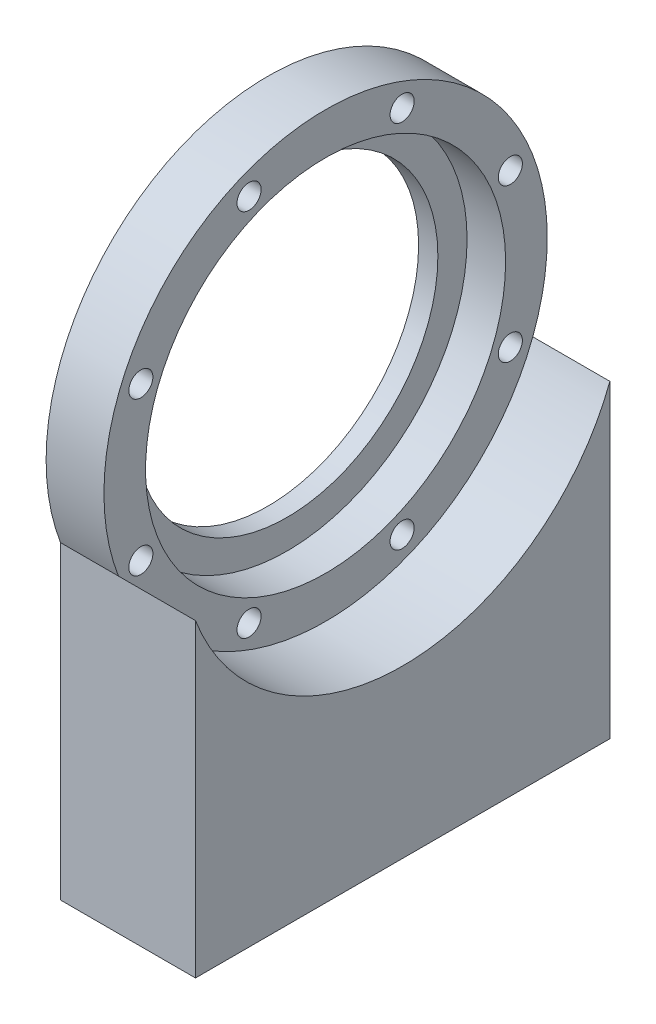
ISO-10303-21;
HEADER;
FILE_DESCRIPTION(('STEP AP214'),'2;1');
FILE_NAME('part.step','',(''),(''),'','','');
FILE_SCHEMA(('AUTOMOTIVE_DESIGN { 1 0 10303 214 1 1 1 1 }'));
ENDSEC;
DATA;
#1=APPLICATION_CONTEXT('core data for automotive mechanical design processes');
#2=APPLICATION_PROTOCOL_DEFINITION('international standard','automotive_design',2000,#1);
#3=PRODUCT_CONTEXT('',#1,'mechanical');
#4=PRODUCT('Part','Part','',(#3));
#5=PRODUCT_RELATED_PRODUCT_CATEGORY('part','',(#4));
#6=PRODUCT_DEFINITION_FORMATION('','',#4);
#7=PRODUCT_DEFINITION_CONTEXT('part definition',#1,'design');
#8=PRODUCT_DEFINITION('design','',#6,#7);
#9=PRODUCT_DEFINITION_SHAPE('','',#8);
#10=(LENGTH_UNIT() NAMED_UNIT(*) SI_UNIT(.MILLI.,.METRE.));
#11=(NAMED_UNIT(*) PLANE_ANGLE_UNIT() SI_UNIT($,.RADIAN.));
#12=(NAMED_UNIT(*) SI_UNIT($,.STERADIAN.) SOLID_ANGLE_UNIT());
#13=UNCERTAINTY_MEASURE_WITH_UNIT(LENGTH_MEASURE(1.E-05),#10,'distance_accuracy_value','');
#14=(GEOMETRIC_REPRESENTATION_CONTEXT(3) GLOBAL_UNCERTAINTY_ASSIGNED_CONTEXT((#13)) GLOBAL_UNIT_ASSIGNED_CONTEXT((#10,
#11,#12)) REPRESENTATION_CONTEXT('',''));
#15=CARTESIAN_POINT('',(0.,0.,0.));
#16=DIRECTION('',(0.,0.,1.));
#17=DIRECTION('',(1.,0.,0.));
#18=AXIS2_PLACEMENT_3D('',#15,#16,#17);
#19=CARTESIAN_POINT('',(2.,0.,0.));
#20=DIRECTION('',(-1.,0.,0.));
#21=DIRECTION('',(0.,0.,1.));
#22=AXIS2_PLACEMENT_3D('',#19,#20,#21);
#23=CYLINDRICAL_SURFACE('',#22,15.6521739130435);
#24=CARTESIAN_POINT('',(2.,0.,0.));
#25=DIRECTION('',(1.,0.,0.));
#26=DIRECTION('',(0.,0.,-1.));
#27=AXIS2_PLACEMENT_3D('',#24,#25,#26);
#28=CIRCLE('',#27,15.6521739130435);
#29=CARTESIAN_POINT('',(2.,0.,-15.6521739130435));
#30=VERTEX_POINT('',#29);
#31=EDGE_CURVE('E11',#30,#30,#28,.T.);
#32=ORIENTED_EDGE('',*,*,#31,.T.);
#33=EDGE_LOOP('',(#32));
#34=FACE_BOUND('',#33,.T.);
#35=CARTESIAN_POINT('',(0.,0.,0.));
#36=DIRECTION('',(1.,0.,0.));
#37=DIRECTION('',(0.,0.,-1.));
#38=AXIS2_PLACEMENT_3D('',#35,#36,#37);
#39=CIRCLE('',#38,15.6521739130435);
#40=CARTESIAN_POINT('',(0.,0.,-15.6521739130435));
#41=VERTEX_POINT('',#40);
#42=EDGE_CURVE('E49',#41,#41,#39,.T.);
#43=ORIENTED_EDGE('',*,*,#42,.F.);
#44=EDGE_LOOP('',(#43));
#45=FACE_BOUND('',#44,.T.);
#46=ADVANCED_FACE('F46',(#34,#45),#23,.F.);
#47=CARTESIAN_POINT('',(2.,0.,0.));
#48=DIRECTION('',(1.,0.,0.));
#49=DIRECTION('',(0.,0.,-1.));
#50=AXIS2_PLACEMENT_3D('',#47,#48,#49);
#51=PLANE('',#50);
#52=ORIENTED_EDGE('',*,*,#31,.F.);
#53=EDGE_LOOP('',(#52));
#54=FACE_BOUND('',#53,.T.);
#55=CARTESIAN_POINT('',(2.,0.,0.));
#56=DIRECTION('',(1.,0.,0.));
#57=DIRECTION('',(0.,0.,-1.));
#58=AXIS2_PLACEMENT_3D('',#55,#56,#57);
#59=CIRCLE('',#58,18.68);
#60=CARTESIAN_POINT('',(2.,0.,-18.68));
#61=VERTEX_POINT('',#60);
#62=EDGE_CURVE('E164',#61,#61,#59,.F.);
#63=ORIENTED_EDGE('',*,*,#62,.F.);
#64=EDGE_LOOP('',(#63));
#65=FACE_BOUND('',#64,.T.);
#66=ADVANCED_FACE('F200',(#54,#65),#51,.T.);
#67=CARTESIAN_POINT('',(0.,0.,0.));
#68=DIRECTION('',(1.,0.,0.));
#69=DIRECTION('',(0.,0.,-1.));
#70=AXIS2_PLACEMENT_3D('',#67,#68,#69);
#71=PLANE('',#70);
#72=ORIENTED_EDGE('',*,*,#42,.T.);
#73=EDGE_LOOP('',(#72));
#74=FACE_BOUND('',#73,.T.);
#75=CARTESIAN_POINT('',(0.,19.1705002996092,7.9406812215757));
#76=DIRECTION('',(1.,0.,0.));
#77=DIRECTION('',(0.,0.,-1.));
#78=AXIS2_PLACEMENT_3D('',#75,#76,#77);
#79=CIRCLE('',#78,1.25);
#80=CARTESIAN_POINT('',(0.,19.1705002996092,6.6906812215757));
#81=VERTEX_POINT('',#80);
#82=EDGE_CURVE('E129',#81,#81,#79,.T.);
#83=ORIENTED_EDGE('',*,*,#82,.T.);
#84=EDGE_LOOP('',(#83));
#85=FACE_BOUND('',#84,.T.);
#86=CARTESIAN_POINT('',(0.,7.94068122157552,19.1705002996092));
#87=DIRECTION('',(1.,0.,0.));
#88=DIRECTION('',(0.,0.,-1.));
#89=AXIS2_PLACEMENT_3D('',#86,#87,#88);
#90=CIRCLE('',#89,1.25);
#91=CARTESIAN_POINT('',(0.,7.94068122157552,17.9205002996092));
#92=VERTEX_POINT('',#91);
#93=EDGE_CURVE('E167',#92,#92,#90,.T.);
#94=ORIENTED_EDGE('',*,*,#93,.T.);
#95=EDGE_LOOP('',(#94));
#96=FACE_BOUND('',#95,.T.);
#97=CARTESIAN_POINT('',(0.,-7.94068122157571,19.1705002996092));
#98=DIRECTION('',(1.,0.,0.));
#99=DIRECTION('',(0.,0.,-1.));
#100=AXIS2_PLACEMENT_3D('',#97,#98,#99);
#101=CIRCLE('',#100,1.25);
#102=CARTESIAN_POINT('',(0.,-7.94068122157571,17.9205002996092));
#103=VERTEX_POINT('',#102);
#104=EDGE_CURVE('E170',#103,#103,#101,.T.);
#105=ORIENTED_EDGE('',*,*,#104,.T.);
#106=EDGE_LOOP('',(#105));
#107=FACE_BOUND('',#106,.T.);
#108=CARTESIAN_POINT('',(0.,-19.1705002996092,7.94068122157552));
#109=DIRECTION('',(1.,0.,0.));
#110=DIRECTION('',(0.,0.,-1.));
#111=AXIS2_PLACEMENT_3D('',#108,#109,#110);
#112=CIRCLE('',#111,1.25);
#113=CARTESIAN_POINT('',(0.,-19.1705002996092,6.69068122157552));
#114=VERTEX_POINT('',#113);
#115=EDGE_CURVE('E173',#114,#114,#112,.T.);
#116=ORIENTED_EDGE('',*,*,#115,.T.);
#117=EDGE_LOOP('',(#116));
#118=FACE_BOUND('',#117,.T.);
#119=CARTESIAN_POINT('',(0.,-19.1705002996092,-7.94068122157571));
#120=DIRECTION('',(1.,0.,0.));
#121=DIRECTION('',(0.,0.,-1.));
#122=AXIS2_PLACEMENT_3D('',#119,#120,#121);
#123=CIRCLE('',#122,1.25);
#124=CARTESIAN_POINT('',(0.,-19.1705002996092,-9.1906812215757));
#125=VERTEX_POINT('',#124);
#126=EDGE_CURVE('E176',#125,#125,#123,.T.);
#127=ORIENTED_EDGE('',*,*,#126,.T.);
#128=EDGE_LOOP('',(#127));
#129=FACE_BOUND('',#128,.T.);
#130=CARTESIAN_POINT('',(0.,-7.94068122157552,-19.1705002996092));
#131=DIRECTION('',(1.,0.,0.));
#132=DIRECTION('',(0.,0.,-1.));
#133=AXIS2_PLACEMENT_3D('',#130,#131,#132);
#134=CIRCLE('',#133,1.25);
#135=CARTESIAN_POINT('',(0.,-7.94068122157552,-20.4205002996092));
#136=VERTEX_POINT('',#135);
#137=EDGE_CURVE('E179',#136,#136,#134,.T.);
#138=ORIENTED_EDGE('',*,*,#137,.T.);
#139=EDGE_LOOP('',(#138));
#140=FACE_BOUND('',#139,.T.);
#141=CARTESIAN_POINT('',(0.,7.94068122157571,-19.1705002996092));
#142=DIRECTION('',(1.,0.,0.));
#143=DIRECTION('',(0.,0.,-1.));
#144=AXIS2_PLACEMENT_3D('',#141,#142,#143);
#145=CIRCLE('',#144,1.25);
#146=CARTESIAN_POINT('',(0.,7.94068122157571,-20.4205002996092));
#147=VERTEX_POINT('',#146);
#148=EDGE_CURVE('E182',#147,#147,#145,.T.);
#149=ORIENTED_EDGE('',*,*,#148,.T.);
#150=EDGE_LOOP('',(#149));
#151=FACE_BOUND('',#150,.T.);
#152=CARTESIAN_POINT('',(0.,19.1705002996092,-7.94068122157552));
#153=DIRECTION('',(1.,0.,0.));
#154=DIRECTION('',(0.,0.,-1.));
#155=AXIS2_PLACEMENT_3D('',#152,#153,#154);
#156=CIRCLE('',#155,1.25);
#157=CARTESIAN_POINT('',(0.,19.1705002996092,-9.19068122157552));
#158=VERTEX_POINT('',#157);
#159=EDGE_CURVE('E185',#158,#158,#156,.T.);
#160=ORIENTED_EDGE('',*,*,#159,.T.);
#161=EDGE_LOOP('',(#160));
#162=FACE_BOUND('',#161,.T.);
#163=CARTESIAN_POINT('',(0.,0.,0.));
#164=DIRECTION('',(1.,0.,0.));
#165=DIRECTION('',(0.,0.,-1.));
#166=AXIS2_PLACEMENT_3D('',#163,#164,#165);
#167=CIRCLE('',#166,23.);
#168=CARTESIAN_POINT('',(0.,-8.1700673191841,-21.5));
#169=VERTEX_POINT('',#168);
#170=CARTESIAN_POINT('',(0.,-8.1700673191841,21.5));
#171=VERTEX_POINT('',#170);
#172=EDGE_CURVE('E138',#169,#171,#167,.T.);
#173=ORIENTED_EDGE('',*,*,#172,.F.);
#174=DIRECTION('',(0.,-1.,0.));
#175=VECTOR('',#174,1.);
#176=CARTESIAN_POINT('',(0.,-40.29,-21.5));
#177=LINE('',#176,#175);
#178=CARTESIAN_POINT('',(0.,-40.29,-21.5));
#179=VERTEX_POINT('',#178);
#180=EDGE_CURVE('E122',#169,#179,#177,.T.);
#181=ORIENTED_EDGE('',*,*,#180,.T.);
#182=DIRECTION('',(0.,0.,1.));
#183=VECTOR('',#182,1.);
#184=CARTESIAN_POINT('',(0.,-40.29,-21.5));
#185=LINE('',#184,#183);
#186=CARTESIAN_POINT('',(0.,-40.29,21.5));
#187=VERTEX_POINT('',#186);
#188=EDGE_CURVE('E113',#179,#187,#185,.T.);
#189=ORIENTED_EDGE('',*,*,#188,.T.);
#190=DIRECTION('',(0.,1.,0.));
#191=VECTOR('',#190,1.);
#192=CARTESIAN_POINT('',(0.,-40.29,21.5));
#193=LINE('',#192,#191);
#194=EDGE_CURVE('E110',#187,#171,#193,.T.);
#195=ORIENTED_EDGE('',*,*,#194,.T.);
#196=EDGE_LOOP('',(#173,#181,#189,#195));
#197=FACE_BOUND('',#196,.T.);
#198=ADVANCED_FACE('F196',(#74,#85,#96,#107,#118,#129,#140,#151,#162,#197),#71,.F.);
#199=CARTESIAN_POINT('',(6.,0.,0.));
#200=DIRECTION('',(-1.,0.,0.));
#201=DIRECTION('',(0.,0.,1.));
#202=AXIS2_PLACEMENT_3D('',#199,#200,#201);
#203=CYLINDRICAL_SURFACE('',#202,18.68);
#204=ORIENTED_EDGE('',*,*,#62,.T.);
#205=EDGE_LOOP('',(#204));
#206=FACE_BOUND('',#205,.T.);
#207=CARTESIAN_POINT('',(6.,0.,0.));
#208=DIRECTION('',(1.,0.,0.));
#209=DIRECTION('',(0.,0.,-1.));
#210=AXIS2_PLACEMENT_3D('',#207,#208,#209);
#211=CIRCLE('',#210,18.68);
#212=CARTESIAN_POINT('',(6.,0.,-18.68));
#213=VERTEX_POINT('',#212);
#214=EDGE_CURVE('E159',#213,#213,#211,.T.);
#215=ORIENTED_EDGE('',*,*,#214,.T.);
#216=EDGE_LOOP('',(#215));
#217=FACE_BOUND('',#216,.T.);
#218=ADVANCED_FACE('F212',(#206,#217),#203,.F.);
#219=CARTESIAN_POINT('',(6.,19.1705002996092,-7.94068122157552));
#220=DIRECTION('',(-1.,0.,0.));
#221=DIRECTION('',(0.,0.,1.));
#222=AXIS2_PLACEMENT_3D('',#219,#220,#221);
#223=CYLINDRICAL_SURFACE('',#222,1.25);
#224=CARTESIAN_POINT('',(6.,19.1705002996092,-7.94068122157552));
#225=DIRECTION('',(1.,0.,0.));
#226=DIRECTION('',(0.,0.,-1.));
#227=AXIS2_PLACEMENT_3D('',#224,#225,#226);
#228=CIRCLE('',#227,1.25);
#229=CARTESIAN_POINT('',(6.,19.1705002996092,-9.19068122157552));
#230=VERTEX_POINT('',#229);
#231=EDGE_CURVE('E156',#230,#230,#228,.T.);
#232=ORIENTED_EDGE('',*,*,#231,.T.);
#233=EDGE_LOOP('',(#232));
#234=FACE_BOUND('',#233,.T.);
#235=ORIENTED_EDGE('',*,*,#159,.F.);
#236=EDGE_LOOP('',(#235));
#237=FACE_BOUND('',#236,.T.);
#238=ADVANCED_FACE('F242',(#234,#237),#223,.F.);
#239=CARTESIAN_POINT('',(6.,7.94068122157571,-19.1705002996092));
#240=DIRECTION('',(-1.,0.,0.));
#241=DIRECTION('',(0.,0.,1.));
#242=AXIS2_PLACEMENT_3D('',#239,#240,#241);
#243=CYLINDRICAL_SURFACE('',#242,1.25);
#244=CARTESIAN_POINT('',(6.,7.94068122157571,-19.1705002996092));
#245=DIRECTION('',(1.,0.,0.));
#246=DIRECTION('',(0.,0.,-1.));
#247=AXIS2_PLACEMENT_3D('',#244,#245,#246);
#248=CIRCLE('',#247,1.25);
#249=CARTESIAN_POINT('',(6.,7.94068122157571,-20.4205002996092));
#250=VERTEX_POINT('',#249);
#251=EDGE_CURVE('E153',#250,#250,#248,.T.);
#252=ORIENTED_EDGE('',*,*,#251,.T.);
#253=EDGE_LOOP('',(#252));
#254=FACE_BOUND('',#253,.T.);
#255=ORIENTED_EDGE('',*,*,#148,.F.);
#256=EDGE_LOOP('',(#255));
#257=FACE_BOUND('',#256,.T.);
#258=ADVANCED_FACE('F238',(#254,#257),#243,.F.);
#259=CARTESIAN_POINT('',(6.,-7.94068122157552,-19.1705002996092));
#260=DIRECTION('',(-1.,0.,0.));
#261=DIRECTION('',(0.,0.,1.));
#262=AXIS2_PLACEMENT_3D('',#259,#260,#261);
#263=CYLINDRICAL_SURFACE('',#262,1.25);
#264=CARTESIAN_POINT('',(6.,-7.94068122157552,-19.1705002996092));
#265=DIRECTION('',(1.,0.,0.));
#266=DIRECTION('',(0.,0.,-1.));
#267=AXIS2_PLACEMENT_3D('',#264,#265,#266);
#268=CIRCLE('',#267,1.25);
#269=CARTESIAN_POINT('',(6.,-7.94068122157552,-20.4205002996092));
#270=VERTEX_POINT('',#269);
#271=EDGE_CURVE('E150',#270,#270,#268,.T.);
#272=ORIENTED_EDGE('',*,*,#271,.T.);
#273=EDGE_LOOP('',(#272));
#274=FACE_BOUND('',#273,.T.);
#275=ORIENTED_EDGE('',*,*,#137,.F.);
#276=EDGE_LOOP('',(#275));
#277=FACE_BOUND('',#276,.T.);
#278=ADVANCED_FACE('F234',(#274,#277),#263,.F.);
#279=CARTESIAN_POINT('',(6.,-19.1705002996092,-7.94068122157571));
#280=DIRECTION('',(-1.,0.,0.));
#281=DIRECTION('',(0.,0.,1.));
#282=AXIS2_PLACEMENT_3D('',#279,#280,#281);
#283=CYLINDRICAL_SURFACE('',#282,1.25);
#284=CARTESIAN_POINT('',(6.,-19.1705002996092,-7.94068122157571));
#285=DIRECTION('',(1.,0.,0.));
#286=DIRECTION('',(0.,0.,-1.));
#287=AXIS2_PLACEMENT_3D('',#284,#285,#286);
#288=CIRCLE('',#287,1.25);
#289=CARTESIAN_POINT('',(6.,-19.1705002996092,-9.1906812215757));
#290=VERTEX_POINT('',#289);
#291=EDGE_CURVE('E147',#290,#290,#288,.T.);
#292=ORIENTED_EDGE('',*,*,#291,.T.);
#293=EDGE_LOOP('',(#292));
#294=FACE_BOUND('',#293,.T.);
#295=ORIENTED_EDGE('',*,*,#126,.F.);
#296=EDGE_LOOP('',(#295));
#297=FACE_BOUND('',#296,.T.);
#298=ADVANCED_FACE('F230',(#294,#297),#283,.F.);
#299=CARTESIAN_POINT('',(6.,-19.1705002996092,7.94068122157552));
#300=DIRECTION('',(-1.,0.,0.));
#301=DIRECTION('',(0.,0.,1.));
#302=AXIS2_PLACEMENT_3D('',#299,#300,#301);
#303=CYLINDRICAL_SURFACE('',#302,1.25);
#304=CARTESIAN_POINT('',(6.,-19.1705002996092,7.94068122157552));
#305=DIRECTION('',(1.,0.,0.));
#306=DIRECTION('',(0.,0.,-1.));
#307=AXIS2_PLACEMENT_3D('',#304,#305,#306);
#308=CIRCLE('',#307,1.25);
#309=CARTESIAN_POINT('',(6.,-19.1705002996092,6.69068122157552));
#310=VERTEX_POINT('',#309);
#311=EDGE_CURVE('E144',#310,#310,#308,.T.);
#312=ORIENTED_EDGE('',*,*,#311,.T.);
#313=EDGE_LOOP('',(#312));
#314=FACE_BOUND('',#313,.T.);
#315=ORIENTED_EDGE('',*,*,#115,.F.);
#316=EDGE_LOOP('',(#315));
#317=FACE_BOUND('',#316,.T.);
#318=ADVANCED_FACE('F226',(#314,#317),#303,.F.);
#319=CARTESIAN_POINT('',(6.,-7.94068122157571,19.1705002996092));
#320=DIRECTION('',(-1.,0.,0.));
#321=DIRECTION('',(0.,0.,1.));
#322=AXIS2_PLACEMENT_3D('',#319,#320,#321);
#323=CYLINDRICAL_SURFACE('',#322,1.25);
#324=CARTESIAN_POINT('',(6.,-7.94068122157571,19.1705002996092));
#325=DIRECTION('',(1.,0.,0.));
#326=DIRECTION('',(0.,0.,-1.));
#327=AXIS2_PLACEMENT_3D('',#324,#325,#326);
#328=CIRCLE('',#327,1.25);
#329=CARTESIAN_POINT('',(6.,-7.94068122157571,17.9205002996092));
#330=VERTEX_POINT('',#329);
#331=EDGE_CURVE('E141',#330,#330,#328,.T.);
#332=ORIENTED_EDGE('',*,*,#331,.T.);
#333=EDGE_LOOP('',(#332));
#334=FACE_BOUND('',#333,.T.);
#335=ORIENTED_EDGE('',*,*,#104,.F.);
#336=EDGE_LOOP('',(#335));
#337=FACE_BOUND('',#336,.T.);
#338=ADVANCED_FACE('F222',(#334,#337),#323,.F.);
#339=CARTESIAN_POINT('',(6.,7.94068122157552,19.1705002996092));
#340=DIRECTION('',(-1.,0.,0.));
#341=DIRECTION('',(0.,0.,1.));
#342=AXIS2_PLACEMENT_3D('',#339,#340,#341);
#343=CYLINDRICAL_SURFACE('',#342,1.25);
#344=CARTESIAN_POINT('',(6.,7.94068122157552,19.1705002996092));
#345=DIRECTION('',(1.,0.,0.));
#346=DIRECTION('',(0.,0.,-1.));
#347=AXIS2_PLACEMENT_3D('',#344,#345,#346);
#348=CIRCLE('',#347,1.25);
#349=CARTESIAN_POINT('',(6.,7.94068122157552,17.9205002996092));
#350=VERTEX_POINT('',#349);
#351=EDGE_CURVE('E137',#350,#350,#348,.T.);
#352=ORIENTED_EDGE('',*,*,#351,.T.);
#353=EDGE_LOOP('',(#352));
#354=FACE_BOUND('',#353,.T.);
#355=ORIENTED_EDGE('',*,*,#93,.F.);
#356=EDGE_LOOP('',(#355));
#357=FACE_BOUND('',#356,.T.);
#358=ADVANCED_FACE('F218',(#354,#357),#343,.F.);
#359=CARTESIAN_POINT('',(6.,19.1705002996092,7.9406812215757));
#360=DIRECTION('',(-1.,0.,0.));
#361=DIRECTION('',(0.,0.,1.));
#362=AXIS2_PLACEMENT_3D('',#359,#360,#361);
#363=CYLINDRICAL_SURFACE('',#362,1.25);
#364=CARTESIAN_POINT('',(6.,19.1705002996092,7.9406812215757));
#365=DIRECTION('',(1.,0.,0.));
#366=DIRECTION('',(0.,0.,-1.));
#367=AXIS2_PLACEMENT_3D('',#364,#365,#366);
#368=CIRCLE('',#367,1.25);
#369=CARTESIAN_POINT('',(6.,19.1705002996092,6.6906812215757));
#370=VERTEX_POINT('',#369);
#371=EDGE_CURVE('E134',#370,#370,#368,.T.);
#372=ORIENTED_EDGE('',*,*,#371,.T.);
#373=EDGE_LOOP('',(#372));
#374=FACE_BOUND('',#373,.T.);
#375=ORIENTED_EDGE('',*,*,#82,.F.);
#376=EDGE_LOOP('',(#375));
#377=FACE_BOUND('',#376,.T.);
#378=ADVANCED_FACE('F214',(#374,#377),#363,.F.);
#379=CARTESIAN_POINT('',(6.,0.,0.));
#380=DIRECTION('',(-1.,0.,0.));
#381=DIRECTION('',(0.,0.,1.));
#382=AXIS2_PLACEMENT_3D('',#379,#380,#381);
#383=CYLINDRICAL_SURFACE('',#382,23.);
#384=ORIENTED_EDGE('',*,*,#172,.T.);
#385=DIRECTION('',(-1.,0.,0.));
#386=VECTOR('',#385,1.);
#387=CARTESIAN_POINT('',(14.,-8.1700673191841,21.5));
#388=LINE('',#387,#386);
#389=CARTESIAN_POINT('',(6.,-8.1700673191841,21.5));
#390=VERTEX_POINT('',#389);
#391=EDGE_CURVE('E130',#390,#171,#388,.T.);
#392=ORIENTED_EDGE('',*,*,#391,.F.);
#393=CARTESIAN_POINT('',(6.,0.,0.));
#394=DIRECTION('',(1.,0.,0.));
#395=DIRECTION('',(0.,0.,-1.));
#396=AXIS2_PLACEMENT_3D('',#393,#394,#395);
#397=CIRCLE('',#396,23.);
#398=CARTESIAN_POINT('',(6.,-8.17006731918412,-21.5));
#399=VERTEX_POINT('',#398);
#400=EDGE_CURVE('E162',#399,#390,#397,.T.);
#401=ORIENTED_EDGE('',*,*,#400,.F.);
#402=DIRECTION('',(-1.,0.,0.));
#403=VECTOR('',#402,1.);
#404=CARTESIAN_POINT('',(14.,-8.1700673191841,-21.5));
#405=LINE('',#404,#403);
#406=EDGE_CURVE('E94',#399,#169,#405,.T.);
#407=ORIENTED_EDGE('',*,*,#406,.T.);
#408=EDGE_LOOP('',(#384,#392,#401,#407));
#409=FACE_BOUND('',#408,.T.);
#410=ADVANCED_FACE('F217',(#409),#383,.T.);
#411=CARTESIAN_POINT('',(6.,0.,0.));
#412=DIRECTION('',(1.,0.,0.));
#413=DIRECTION('',(0.,0.,-1.));
#414=AXIS2_PLACEMENT_3D('',#411,#412,#413);
#415=PLANE('',#414);
#416=ORIENTED_EDGE('',*,*,#371,.F.);
#417=EDGE_LOOP('',(#416));
#418=FACE_BOUND('',#417,.T.);
#419=ORIENTED_EDGE('',*,*,#351,.F.);
#420=EDGE_LOOP('',(#419));
#421=FACE_BOUND('',#420,.T.);
#422=ORIENTED_EDGE('',*,*,#331,.F.);
#423=EDGE_LOOP('',(#422));
#424=FACE_BOUND('',#423,.T.);
#425=ORIENTED_EDGE('',*,*,#311,.F.);
#426=EDGE_LOOP('',(#425));
#427=FACE_BOUND('',#426,.T.);
#428=ORIENTED_EDGE('',*,*,#291,.F.);
#429=EDGE_LOOP('',(#428));
#430=FACE_BOUND('',#429,.T.);
#431=ORIENTED_EDGE('',*,*,#271,.F.);
#432=EDGE_LOOP('',(#431));
#433=FACE_BOUND('',#432,.T.);
#434=ORIENTED_EDGE('',*,*,#251,.F.);
#435=EDGE_LOOP('',(#434));
#436=FACE_BOUND('',#435,.T.);
#437=ORIENTED_EDGE('',*,*,#231,.F.);
#438=EDGE_LOOP('',(#437));
#439=FACE_BOUND('',#438,.T.);
#440=ORIENTED_EDGE('',*,*,#214,.F.);
#441=EDGE_LOOP('',(#440));
#442=FACE_BOUND('',#441,.T.);
#443=EDGE_CURVE('E65',#390,#399,#397,.T.);
#444=ORIENTED_EDGE('',*,*,#443,.T.);
#445=ORIENTED_EDGE('',*,*,#400,.T.);
#446=EDGE_LOOP('',(#444,#445));
#447=FACE_BOUND('',#446,.T.);
#448=ADVANCED_FACE('F251',(#418,#421,#424,#427,#430,#433,#436,#439,#442,#447),#415,.T.);
#449=CARTESIAN_POINT('',(14.,0.,0.));
#450=DIRECTION('',(-1.,0.,0.));
#451=DIRECTION('',(0.,0.,1.));
#452=AXIS2_PLACEMENT_3D('',#449,#450,#451);
#453=CYLINDRICAL_SURFACE('',#452,23.);
#454=CARTESIAN_POINT('',(14.,-8.1700673191841,-21.5));
#455=VERTEX_POINT('',#454);
#456=EDGE_CURVE('E60',#455,#399,#405,.T.);
#457=ORIENTED_EDGE('',*,*,#456,.T.);
#458=ORIENTED_EDGE('',*,*,#443,.F.);
#459=CARTESIAN_POINT('',(14.,-8.1700673191841,21.5));
#460=VERTEX_POINT('',#459);
#461=EDGE_CURVE('E109',#460,#390,#388,.T.);
#462=ORIENTED_EDGE('',*,*,#461,.F.);
#463=CARTESIAN_POINT('',(14.,0.,0.));
#464=DIRECTION('',(1.,0.,0.));
#465=DIRECTION('',(0.,0.,1.));
#466=AXIS2_PLACEMENT_3D('',#463,#464,#465);
#467=CIRCLE('',#466,23.);
#468=EDGE_CURVE('E103',#460,#455,#467,.T.);
#469=ORIENTED_EDGE('',*,*,#468,.T.);
#470=EDGE_LOOP('',(#457,#458,#462,#469));
#471=FACE_BOUND('',#470,.T.);
#472=ADVANCED_FACE('F108',(#471),#453,.F.);
#473=CARTESIAN_POINT('',(14.,-40.29,21.5));
#474=DIRECTION('',(0.,0.,1.));
#475=DIRECTION('',(1.,0.,0.));
#476=AXIS2_PLACEMENT_3D('',#473,#474,#475);
#477=PLANE('',#476);
#478=ORIENTED_EDGE('',*,*,#194,.F.);
#479=DIRECTION('',(-1.,0.,0.));
#480=VECTOR('',#479,1.);
#481=CARTESIAN_POINT('',(14.,-40.29,21.5));
#482=LINE('',#481,#480);
#483=CARTESIAN_POINT('',(14.,-40.29,21.5));
#484=VERTEX_POINT('',#483);
#485=EDGE_CURVE('E131',#484,#187,#482,.T.);
#486=ORIENTED_EDGE('',*,*,#485,.F.);
#487=DIRECTION('',(0.,1.,0.));
#488=VECTOR('',#487,1.);
#489=CARTESIAN_POINT('',(14.,-40.29,21.5));
#490=LINE('',#489,#488);
#491=EDGE_CURVE('E120',#484,#460,#490,.T.);
#492=ORIENTED_EDGE('',*,*,#491,.T.);
#493=ORIENTED_EDGE('',*,*,#461,.T.);
#494=ORIENTED_EDGE('',*,*,#391,.T.);
#495=EDGE_LOOP('',(#478,#486,#492,#493,#494));
#496=FACE_BOUND('',#495,.T.);
#497=ADVANCED_FACE('F258',(#496),#477,.T.);
#498=CARTESIAN_POINT('',(14.,-40.29,-21.5));
#499=DIRECTION('',(0.,-1.,0.));
#500=DIRECTION('',(0.,0.,-1.));
#501=AXIS2_PLACEMENT_3D('',#498,#499,#500);
#502=PLANE('',#501);
#503=CARTESIAN_POINT('',(3.46367339077518,-40.29,17.5));
#504=DIRECTION('',(0.,1.,0.));
#505=DIRECTION('',(0.,0.,-1.));
#506=AXIS2_PLACEMENT_3D('',#503,#504,#505);
#507=CIRCLE('',#506,1.8);
#508=CARTESIAN_POINT('',(3.46367339077518,-40.29,15.7));
#509=VERTEX_POINT('',#508);
#510=EDGE_CURVE('E307',#509,#509,#507,.T.);
#511=ORIENTED_EDGE('',*,*,#510,.T.);
#512=EDGE_LOOP('',(#511));
#513=FACE_BOUND('',#512,.T.);
#514=CARTESIAN_POINT('',(3.46367339077518,-40.29,-17.5));
#515=DIRECTION('',(0.,-1.,0.));
#516=DIRECTION('',(0.,0.,1.));
#517=AXIS2_PLACEMENT_3D('',#514,#515,#516);
#518=CIRCLE('',#517,1.8);
#519=CARTESIAN_POINT('',(3.46367339077518,-40.29,-15.7));
#520=VERTEX_POINT('',#519);
#521=EDGE_CURVE('E306',#520,#520,#518,.T.);
#522=ORIENTED_EDGE('',*,*,#521,.F.);
#523=EDGE_LOOP('',(#522));
#524=FACE_BOUND('',#523,.T.);
#525=CARTESIAN_POINT('',(10.5363266092248,-40.29,-17.5));
#526=DIRECTION('',(0.,1.,0.));
#527=DIRECTION('',(0.,0.,1.));
#528=AXIS2_PLACEMENT_3D('',#525,#526,#527);
#529=CIRCLE('',#528,1.8);
#530=CARTESIAN_POINT('',(10.5363266092248,-40.29,-15.7));
#531=VERTEX_POINT('',#530);
#532=EDGE_CURVE('E316',#531,#531,#529,.T.);
#533=ORIENTED_EDGE('',*,*,#532,.T.);
#534=EDGE_LOOP('',(#533));
#535=FACE_BOUND('',#534,.T.);
#536=CARTESIAN_POINT('',(10.5363266092248,-40.29,17.5));
#537=DIRECTION('',(0.,-1.,0.));
#538=DIRECTION('',(0.,0.,-1.));
#539=AXIS2_PLACEMENT_3D('',#536,#537,#538);
#540=CIRCLE('',#539,1.8);
#541=CARTESIAN_POINT('',(10.5363266092248,-40.29,15.7));
#542=VERTEX_POINT('',#541);
#543=EDGE_CURVE('E116',#542,#542,#540,.T.);
#544=ORIENTED_EDGE('',*,*,#543,.F.);
#545=EDGE_LOOP('',(#544));
#546=FACE_BOUND('',#545,.T.);
#547=ORIENTED_EDGE('',*,*,#188,.F.);
#548=DIRECTION('',(-1.,0.,0.));
#549=VECTOR('',#548,1.);
#550=CARTESIAN_POINT('',(14.,-40.29,-21.5));
#551=LINE('',#550,#549);
#552=CARTESIAN_POINT('',(14.,-40.29,-21.5));
#553=VERTEX_POINT('',#552);
#554=EDGE_CURVE('E96',#553,#179,#551,.T.);
#555=ORIENTED_EDGE('',*,*,#554,.F.);
#556=DIRECTION('',(0.,0.,1.));
#557=VECTOR('',#556,1.);
#558=CARTESIAN_POINT('',(14.,-40.29,-21.5));
#559=LINE('',#558,#557);
#560=EDGE_CURVE('E106',#553,#484,#559,.T.);
#561=ORIENTED_EDGE('',*,*,#560,.T.);
#562=ORIENTED_EDGE('',*,*,#485,.T.);
#563=EDGE_LOOP('',(#547,#555,#561,#562));
#564=FACE_BOUND('',#563,.T.);
#565=ADVANCED_FACE('F261',(#513,#524,#535,#546,#564),#502,.T.);
#566=CARTESIAN_POINT('',(14.,-40.29,-21.5));
#567=DIRECTION('',(0.,0.,-1.));
#568=DIRECTION('',(0.,1.,0.));
#569=AXIS2_PLACEMENT_3D('',#566,#567,#568);
#570=PLANE('',#569);
#571=ORIENTED_EDGE('',*,*,#180,.F.);
#572=ORIENTED_EDGE('',*,*,#406,.F.);
#573=ORIENTED_EDGE('',*,*,#456,.F.);
#574=DIRECTION('',(0.,-1.,0.));
#575=VECTOR('',#574,1.);
#576=CARTESIAN_POINT('',(14.,-40.29,-21.5));
#577=LINE('',#576,#575);
#578=EDGE_CURVE('E92',#455,#553,#577,.T.);
#579=ORIENTED_EDGE('',*,*,#578,.T.);
#580=ORIENTED_EDGE('',*,*,#554,.T.);
#581=EDGE_LOOP('',(#571,#572,#573,#579,#580));
#582=FACE_BOUND('',#581,.T.);
#583=ADVANCED_FACE('F91',(#582),#570,.T.);
#584=CARTESIAN_POINT('',(14.,0.,0.));
#585=DIRECTION('',(-1.,0.,0.));
#586=DIRECTION('',(0.,0.,1.));
#587=AXIS2_PLACEMENT_3D('',#584,#585,#586);
#588=PLANE('',#587);
#589=ORIENTED_EDGE('',*,*,#468,.F.);
#590=ORIENTED_EDGE('',*,*,#491,.F.);
#591=ORIENTED_EDGE('',*,*,#560,.F.);
#592=ORIENTED_EDGE('',*,*,#578,.F.);
#593=EDGE_LOOP('',(#589,#590,#591,#592));
#594=FACE_BOUND('',#593,.T.);
#595=ADVANCED_FACE('F101',(#594),#588,.F.);
#596=CARTESIAN_POINT('',(10.5363266092248,-35.29,17.5));
#597=DIRECTION('',(0.,-1.,0.));
#598=DIRECTION('',(0.,0.,-1.));
#599=AXIS2_PLACEMENT_3D('',#596,#597,#598);
#600=CYLINDRICAL_SURFACE('',#599,1.8);
#601=CARTESIAN_POINT('',(10.5363266092248,-35.29,17.5));
#602=DIRECTION('',(0.,-1.,0.));
#603=DIRECTION('',(0.,0.,-1.));
#604=AXIS2_PLACEMENT_3D('',#601,#602,#603);
#605=CIRCLE('',#604,1.8);
#606=CARTESIAN_POINT('',(10.5363266092248,-35.29,15.7));
#607=VERTEX_POINT('',#606);
#608=EDGE_CURVE('E125',#607,#607,#605,.T.);
#609=ORIENTED_EDGE('',*,*,#608,.F.);
#610=EDGE_LOOP('',(#609));
#611=FACE_BOUND('',#610,.T.);
#612=ORIENTED_EDGE('',*,*,#543,.T.);
#613=EDGE_LOOP('',(#612));
#614=FACE_BOUND('',#613,.T.);
#615=ADVANCED_FACE('F270',(#611,#614),#600,.F.);
#616=CARTESIAN_POINT('',(10.5363266092248,-35.29,17.5));
#617=DIRECTION('',(0.,-1.,0.));
#618=DIRECTION('',(0.,0.,-1.));
#619=AXIS2_PLACEMENT_3D('',#616,#617,#618);
#620=PLANE('',#619);
#621=ORIENTED_EDGE('',*,*,#608,.T.);
#622=EDGE_LOOP('',(#621));
#623=FACE_BOUND('',#622,.T.);
#624=ADVANCED_FACE('F273',(#623),#620,.T.);
#625=CARTESIAN_POINT('',(10.5363266092248,-35.29,-17.5));
#626=DIRECTION('',(0.,-1.,0.));
#627=DIRECTION('',(0.,0.,-1.));
#628=AXIS2_PLACEMENT_3D('',#625,#626,#627);
#629=CYLINDRICAL_SURFACE('',#628,1.8);
#630=CARTESIAN_POINT('',(10.5363266092248,-35.29,-17.5));
#631=DIRECTION('',(0.,1.,0.));
#632=DIRECTION('',(0.,0.,1.));
#633=AXIS2_PLACEMENT_3D('',#630,#631,#632);
#634=CIRCLE('',#633,1.8);
#635=CARTESIAN_POINT('',(10.5363266092248,-35.29,-15.7));
#636=VERTEX_POINT('',#635);
#637=EDGE_CURVE('E318',#636,#636,#634,.T.);
#638=ORIENTED_EDGE('',*,*,#637,.T.);
#639=EDGE_LOOP('',(#638));
#640=FACE_BOUND('',#639,.T.);
#641=ORIENTED_EDGE('',*,*,#532,.F.);
#642=EDGE_LOOP('',(#641));
#643=FACE_BOUND('',#642,.T.);
#644=ADVANCED_FACE('F277',(#640,#643),#629,.F.);
#645=CARTESIAN_POINT('',(10.5363266092248,-35.29,-17.5));
#646=DIRECTION('',(0.,-1.,0.));
#647=DIRECTION('',(0.,0.,1.));
#648=AXIS2_PLACEMENT_3D('',#645,#646,#647);
#649=PLANE('',#648);
#650=ORIENTED_EDGE('',*,*,#637,.F.);
#651=EDGE_LOOP('',(#650));
#652=FACE_BOUND('',#651,.T.);
#653=ADVANCED_FACE('F281',(#652),#649,.T.);
#654=CARTESIAN_POINT('',(3.46367339077518,-35.29,-17.5));
#655=DIRECTION('',(0.,-1.,0.));
#656=DIRECTION('',(0.,0.,-1.));
#657=AXIS2_PLACEMENT_3D('',#654,#655,#656);
#658=CYLINDRICAL_SURFACE('',#657,1.8);
#659=CARTESIAN_POINT('',(3.46367339077518,-35.29,-17.5));
#660=DIRECTION('',(0.,-1.,0.));
#661=DIRECTION('',(0.,0.,1.));
#662=AXIS2_PLACEMENT_3D('',#659,#660,#661);
#663=CIRCLE('',#662,1.8);
#664=CARTESIAN_POINT('',(3.46367339077518,-35.29,-15.7));
#665=VERTEX_POINT('',#664);
#666=EDGE_CURVE('E310',#665,#665,#663,.T.);
#667=ORIENTED_EDGE('',*,*,#666,.F.);
#668=EDGE_LOOP('',(#667));
#669=FACE_BOUND('',#668,.T.);
#670=ORIENTED_EDGE('',*,*,#521,.T.);
#671=EDGE_LOOP('',(#670));
#672=FACE_BOUND('',#671,.T.);
#673=ADVANCED_FACE('F285',(#669,#672),#658,.F.);
#674=CARTESIAN_POINT('',(3.46367339077518,-35.29,-17.5));
#675=DIRECTION('',(0.,-1.,0.));
#676=DIRECTION('',(0.,0.,1.));
#677=AXIS2_PLACEMENT_3D('',#674,#675,#676);
#678=PLANE('',#677);
#679=ORIENTED_EDGE('',*,*,#666,.T.);
#680=EDGE_LOOP('',(#679));
#681=FACE_BOUND('',#680,.T.);
#682=ADVANCED_FACE('F289',(#681),#678,.T.);
#683=CARTESIAN_POINT('',(3.46367339077518,-35.29,17.5));
#684=DIRECTION('',(0.,-1.,0.));
#685=DIRECTION('',(0.,0.,-1.));
#686=AXIS2_PLACEMENT_3D('',#683,#684,#685);
#687=CYLINDRICAL_SURFACE('',#686,1.8);
#688=CARTESIAN_POINT('',(3.46367339077518,-35.29,17.5));
#689=DIRECTION('',(0.,1.,0.));
#690=DIRECTION('',(0.,0.,-1.));
#691=AXIS2_PLACEMENT_3D('',#688,#689,#690);
#692=CIRCLE('',#691,1.8);
#693=CARTESIAN_POINT('',(3.46367339077518,-35.29,15.7));
#694=VERTEX_POINT('',#693);
#695=EDGE_CURVE('E305',#694,#694,#692,.T.);
#696=ORIENTED_EDGE('',*,*,#695,.T.);
#697=EDGE_LOOP('',(#696));
#698=FACE_BOUND('',#697,.T.);
#699=ORIENTED_EDGE('',*,*,#510,.F.);
#700=EDGE_LOOP('',(#699));
#701=FACE_BOUND('',#700,.T.);
#702=ADVANCED_FACE('F293',(#698,#701),#687,.F.);
#703=CARTESIAN_POINT('',(3.46367339077518,-35.29,17.5));
#704=DIRECTION('',(0.,-1.,0.));
#705=DIRECTION('',(0.,0.,-1.));
#706=AXIS2_PLACEMENT_3D('',#703,#704,#705);
#707=PLANE('',#706);
#708=ORIENTED_EDGE('',*,*,#695,.F.);
#709=EDGE_LOOP('',(#708));
#710=FACE_BOUND('',#709,.T.);
#711=ADVANCED_FACE('F297',(#710),#707,.T.);
#712=CLOSED_SHELL('',(#46,#66,#198,#218,#238,#258,#278,#298,#318,#338,#358,#378,#410,#448,#472,
#497,#565,#583,#595,#615,#624,#644,#653,#673,#682,#702,#711));
#713=MANIFOLD_SOLID_BREP('B2',#712);
#714=ADVANCED_BREP_SHAPE_REPRESENTATION('',(#18,#713),#14);
#715=SHAPE_DEFINITION_REPRESENTATION(#9,#714);
ENDSEC;
END-ISO-10303-21;
